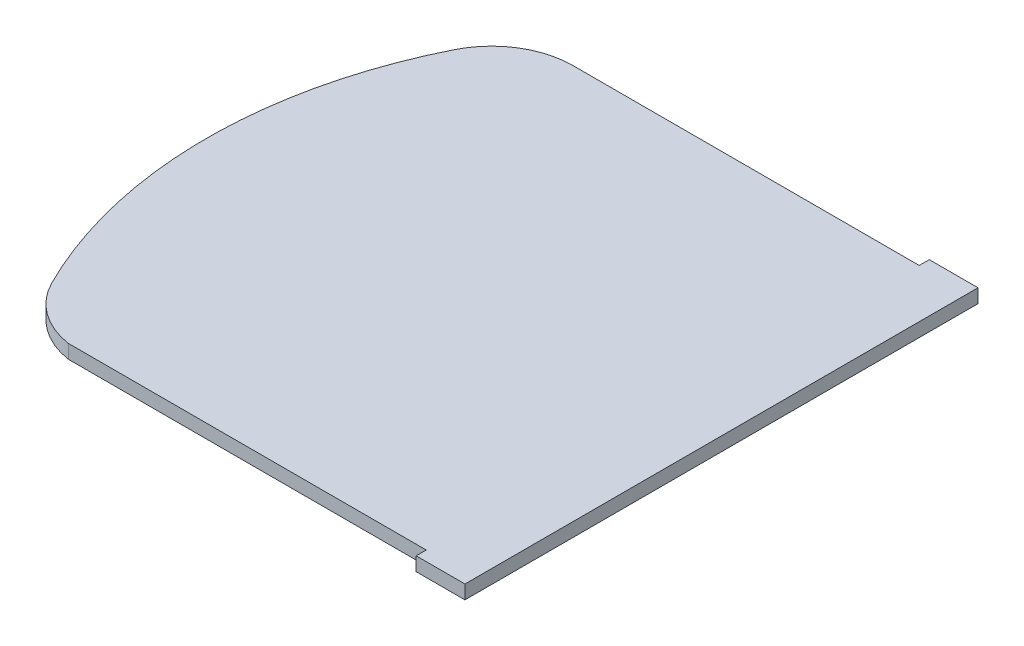
ISO-10303-21;
HEADER;
FILE_DESCRIPTION(('STEP AP214'),'2;1');
FILE_NAME('part.step','',(''),(''),'','','');
FILE_SCHEMA(('AUTOMOTIVE_DESIGN { 1 0 10303 214 1 1 1 1 }'));
ENDSEC;
DATA;
#1=APPLICATION_CONTEXT('core data for automotive mechanical design processes');
#2=APPLICATION_PROTOCOL_DEFINITION('international standard','automotive_design',2000,#1);
#3=PRODUCT_CONTEXT('',#1,'mechanical');
#4=PRODUCT('Part','Part','',(#3));
#5=PRODUCT_RELATED_PRODUCT_CATEGORY('part','',(#4));
#6=PRODUCT_DEFINITION_FORMATION('','',#4);
#7=PRODUCT_DEFINITION_CONTEXT('part definition',#1,'design');
#8=PRODUCT_DEFINITION('design','',#6,#7);
#9=PRODUCT_DEFINITION_SHAPE('','',#8);
#10=(LENGTH_UNIT() NAMED_UNIT(*) SI_UNIT(.MILLI.,.METRE.));
#11=(NAMED_UNIT(*) PLANE_ANGLE_UNIT() SI_UNIT($,.RADIAN.));
#12=(NAMED_UNIT(*) SI_UNIT($,.STERADIAN.) SOLID_ANGLE_UNIT());
#13=UNCERTAINTY_MEASURE_WITH_UNIT(LENGTH_MEASURE(1.E-05),#10,'distance_accuracy_value','');
#14=(GEOMETRIC_REPRESENTATION_CONTEXT(3) GLOBAL_UNCERTAINTY_ASSIGNED_CONTEXT((#13)) GLOBAL_UNIT_ASSIGNED_CONTEXT((#10,
#11,#12)) REPRESENTATION_CONTEXT('',''));
#15=CARTESIAN_POINT('',(0.,0.,0.));
#16=DIRECTION('',(0.,0.,1.));
#17=DIRECTION('',(1.,0.,0.));
#18=AXIS2_PLACEMENT_3D('',#15,#16,#17);
#19=CARTESIAN_POINT('',(0.,6.5,-242.));
#20=DIRECTION('',(0.,0.,1.));
#21=DIRECTION('',(1.,0.,0.));
#22=AXIS2_PLACEMENT_3D('',#19,#20,#21);
#23=PLANE('',#22);
#24=DIRECTION('',(-1.,0.,0.));
#25=VECTOR('',#24,1.);
#26=CARTESIAN_POINT('',(0.,-6.5,-242.));
#27=LINE('',#26,#25);
#28=CARTESIAN_POINT('',(0.,-6.5,-242.));
#29=VERTEX_POINT('',#28);
#30=CARTESIAN_POINT('',(-46.,-6.5,-242.));
#31=VERTEX_POINT('',#30);
#32=EDGE_CURVE('E143',#29,#31,#27,.T.);
#33=ORIENTED_EDGE('',*,*,#32,.T.);
#34=DIRECTION('',(0.,-1.,0.));
#35=VECTOR('',#34,1.);
#36=CARTESIAN_POINT('',(-46.,6.5,-242.));
#37=LINE('',#36,#35);
#38=CARTESIAN_POINT('',(-46.,6.5,-242.));
#39=VERTEX_POINT('',#38);
#40=EDGE_CURVE('E11',#39,#31,#37,.T.);
#41=ORIENTED_EDGE('',*,*,#40,.F.);
#42=DIRECTION('',(-1.,0.,0.));
#43=VECTOR('',#42,1.);
#44=CARTESIAN_POINT('',(0.,6.5,-242.));
#45=LINE('',#44,#43);
#46=CARTESIAN_POINT('',(0.,6.5,-242.));
#47=VERTEX_POINT('',#46);
#48=EDGE_CURVE('E161',#47,#39,#45,.T.);
#49=ORIENTED_EDGE('',*,*,#48,.F.);
#50=DIRECTION('',(0.,-1.,0.));
#51=VECTOR('',#50,1.);
#52=CARTESIAN_POINT('',(0.,6.5,-242.));
#53=LINE('',#52,#51);
#54=EDGE_CURVE('E139',#47,#29,#53,.T.);
#55=ORIENTED_EDGE('',*,*,#54,.T.);
#56=EDGE_LOOP('',(#33,#41,#49,#55));
#57=FACE_BOUND('',#56,.T.);
#58=ADVANCED_FACE('F35',(#57),#23,.F.);
#59=CARTESIAN_POINT('',(-46.,6.5,-242.));
#60=DIRECTION('',(1.,0.,0.));
#61=DIRECTION('',(0.,0.,-1.));
#62=AXIS2_PLACEMENT_3D('',#59,#60,#61);
#63=PLANE('',#62);
#64=DIRECTION('',(0.,0.,1.));
#65=VECTOR('',#64,1.);
#66=CARTESIAN_POINT('',(-46.,-6.5,-242.));
#67=LINE('',#66,#65);
#68=CARTESIAN_POINT('',(-45.9999999999999,-6.5,-232.5));
#69=VERTEX_POINT('',#68);
#70=EDGE_CURVE('E146',#31,#69,#67,.T.);
#71=ORIENTED_EDGE('',*,*,#70,.T.);
#72=DIRECTION('',(0.,-1.,0.));
#73=VECTOR('',#72,1.);
#74=CARTESIAN_POINT('',(-45.9999999999999,6.5,-232.5));
#75=LINE('',#74,#73);
#76=CARTESIAN_POINT('',(-45.9999999999999,6.5,-232.5));
#77=VERTEX_POINT('',#76);
#78=EDGE_CURVE('E43',#77,#69,#75,.T.);
#79=ORIENTED_EDGE('',*,*,#78,.F.);
#80=DIRECTION('',(0.,0.,1.));
#81=VECTOR('',#80,1.);
#82=CARTESIAN_POINT('',(-46.,6.5,-242.));
#83=LINE('',#82,#81);
#84=EDGE_CURVE('E100',#39,#77,#83,.T.);
#85=ORIENTED_EDGE('',*,*,#84,.F.);
#86=ORIENTED_EDGE('',*,*,#40,.T.);
#87=EDGE_LOOP('',(#71,#79,#85,#86));
#88=FACE_BOUND('',#87,.T.);
#89=ADVANCED_FACE('F210',(#88),#63,.F.);
#90=CARTESIAN_POINT('',(-45.9999999999999,6.5,-232.5));
#91=DIRECTION('',(0.,0.,1.));
#92=DIRECTION('',(1.,0.,0.));
#93=AXIS2_PLACEMENT_3D('',#90,#91,#92);
#94=PLANE('',#93);
#95=DIRECTION('',(-1.,0.,0.));
#96=VECTOR('',#95,1.);
#97=CARTESIAN_POINT('',(-45.9999999999999,-6.5,-232.5));
#98=LINE('',#97,#96);
#99=CARTESIAN_POINT('',(-372.443194837078,-6.5,-232.5));
#100=VERTEX_POINT('',#99);
#101=EDGE_CURVE('E148',#69,#100,#98,.T.);
#102=ORIENTED_EDGE('',*,*,#101,.T.);
#103=DIRECTION('',(0.,-1.,0.));
#104=VECTOR('',#103,1.);
#105=CARTESIAN_POINT('',(-372.443194837078,6.5,-232.5));
#106=LINE('',#105,#104);
#107=CARTESIAN_POINT('',(-372.443194837078,6.5,-232.5));
#108=VERTEX_POINT('',#107);
#109=EDGE_CURVE('E174',#108,#100,#106,.T.);
#110=ORIENTED_EDGE('',*,*,#109,.F.);
#111=DIRECTION('',(-1.,0.,0.));
#112=VECTOR('',#111,1.);
#113=CARTESIAN_POINT('',(-45.9999999999999,6.5,-232.5));
#114=LINE('',#113,#112);
#115=EDGE_CURVE('E182',#77,#108,#114,.T.);
#116=ORIENTED_EDGE('',*,*,#115,.F.);
#117=ORIENTED_EDGE('',*,*,#78,.T.);
#118=EDGE_LOOP('',(#102,#110,#116,#117));
#119=FACE_BOUND('',#118,.T.);
#120=ADVANCED_FACE('F180',(#119),#94,.F.);
#121=CARTESIAN_POINT('',(-372.443194837078,6.5,-155.5));
#122=DIRECTION('',(0.,-1.,0.));
#123=DIRECTION('',(0.,0.,-1.));
#124=AXIS2_PLACEMENT_3D('',#121,#122,#123);
#125=CYLINDRICAL_SURFACE('',#124,77.);
#126=CARTESIAN_POINT('',(-372.443194837078,-6.5,-155.5));
#127=DIRECTION('',(0.,1.,0.));
#128=DIRECTION('',(0.,0.,1.));
#129=AXIS2_PLACEMENT_3D('',#126,#127,#128);
#130=CIRCLE('',#129,77.);
#131=CARTESIAN_POINT('',(-441.377653296834,-6.5,-189.808022922636));
#132=VERTEX_POINT('',#131);
#133=EDGE_CURVE('E150',#100,#132,#130,.T.);
#134=ORIENTED_EDGE('',*,*,#133,.T.);
#135=DIRECTION('',(0.,-1.,0.));
#136=VECTOR('',#135,1.);
#137=CARTESIAN_POINT('',(-441.377653296834,6.5,-189.808022922636));
#138=LINE('',#137,#136);
#139=CARTESIAN_POINT('',(-441.377653296834,6.5,-189.808022922636));
#140=VERTEX_POINT('',#139);
#141=EDGE_CURVE('E171',#140,#132,#138,.T.);
#142=ORIENTED_EDGE('',*,*,#141,.F.);
#143=CARTESIAN_POINT('',(-372.443194837078,6.5,-155.5));
#144=DIRECTION('',(0.,1.,0.));
#145=DIRECTION('',(0.,0.,1.));
#146=AXIS2_PLACEMENT_3D('',#143,#144,#145);
#147=CIRCLE('',#146,77.);
#148=EDGE_CURVE('E200',#108,#140,#147,.T.);
#149=ORIENTED_EDGE('',*,*,#148,.F.);
#150=ORIENTED_EDGE('',*,*,#109,.T.);
#151=EDGE_LOOP('',(#134,#142,#149,#150));
#152=FACE_BOUND('',#151,.T.);
#153=ADVANCED_FACE('F191',(#152),#125,.T.);
#154=CARTESIAN_POINT('',(-60.,6.5,0.));
#155=DIRECTION('',(0.,-1.,0.));
#156=DIRECTION('',(0.,0.,-1.));
#157=AXIS2_PLACEMENT_3D('',#154,#155,#156);
#158=CYLINDRICAL_SURFACE('',#157,426.);
#159=CARTESIAN_POINT('',(-60.,-6.5,0.));
#160=DIRECTION('',(0.,1.,0.));
#161=DIRECTION('',(0.,0.,1.));
#162=AXIS2_PLACEMENT_3D('',#159,#160,#161);
#163=CIRCLE('',#162,426.);
#164=CARTESIAN_POINT('',(-440.836676217765,-6.5,190.891136639199));
#165=VERTEX_POINT('',#164);
#166=EDGE_CURVE('E152',#132,#165,#163,.T.);
#167=ORIENTED_EDGE('',*,*,#166,.T.);
#168=DIRECTION('',(0.,-1.,0.));
#169=VECTOR('',#168,1.);
#170=CARTESIAN_POINT('',(-440.836676217765,6.5,190.891136639199));
#171=LINE('',#170,#169);
#172=CARTESIAN_POINT('',(-440.836676217765,6.5,190.891136639199));
#173=VERTEX_POINT('',#172);
#174=EDGE_CURVE('E168',#173,#165,#171,.T.);
#175=ORIENTED_EDGE('',*,*,#174,.F.);
#176=CARTESIAN_POINT('',(-60.,6.5,0.));
#177=DIRECTION('',(0.,1.,0.));
#178=DIRECTION('',(0.,0.,1.));
#179=AXIS2_PLACEMENT_3D('',#176,#177,#178);
#180=CIRCLE('',#179,426.);
#181=EDGE_CURVE('E197',#140,#173,#180,.T.);
#182=ORIENTED_EDGE('',*,*,#181,.F.);
#183=ORIENTED_EDGE('',*,*,#141,.T.);
#184=EDGE_LOOP('',(#167,#175,#182,#183));
#185=FACE_BOUND('',#184,.T.);
#186=ADVANCED_FACE('F195',(#185),#158,.T.);
#187=CARTESIAN_POINT('',(-372.,6.5,156.387339641034));
#188=DIRECTION('',(0.,-1.,0.));
#189=DIRECTION('',(0.,0.,-1.));
#190=AXIS2_PLACEMENT_3D('',#187,#188,#189);
#191=CYLINDRICAL_SURFACE('',#190,77.);
#192=CARTESIAN_POINT('',(-372.,-6.5,156.387339641034));
#193=DIRECTION('',(0.,1.,0.));
#194=DIRECTION('',(0.,0.,1.));
#195=AXIS2_PLACEMENT_3D('',#192,#193,#194);
#196=CIRCLE('',#195,77.);
#197=CARTESIAN_POINT('',(-383.656025612559,-6.5,232.5));
#198=VERTEX_POINT('',#197);
#199=EDGE_CURVE('E154',#165,#198,#196,.T.);
#200=ORIENTED_EDGE('',*,*,#199,.T.);
#201=DIRECTION('',(0.,-1.,0.));
#202=VECTOR('',#201,1.);
#203=CARTESIAN_POINT('',(-383.656025612559,6.5,232.5));
#204=LINE('',#203,#202);
#205=CARTESIAN_POINT('',(-383.656025612559,6.5,232.5));
#206=VERTEX_POINT('',#205);
#207=EDGE_CURVE('E165',#206,#198,#204,.T.);
#208=ORIENTED_EDGE('',*,*,#207,.F.);
#209=CARTESIAN_POINT('',(-372.,6.5,156.387339641034));
#210=DIRECTION('',(0.,1.,0.));
#211=DIRECTION('',(0.,0.,1.));
#212=AXIS2_PLACEMENT_3D('',#209,#210,#211);
#213=CIRCLE('',#212,77.);
#214=EDGE_CURVE('E199',#173,#206,#213,.T.);
#215=ORIENTED_EDGE('',*,*,#214,.F.);
#216=ORIENTED_EDGE('',*,*,#174,.T.);
#217=EDGE_LOOP('',(#200,#208,#215,#216));
#218=FACE_BOUND('',#217,.T.);
#219=ADVANCED_FACE('F222',(#218),#191,.T.);
#220=CARTESIAN_POINT('',(-383.656025612559,6.5,232.5));
#221=DIRECTION('',(0.,0.,-1.));
#222=DIRECTION('',(-1.,0.,0.));
#223=AXIS2_PLACEMENT_3D('',#220,#221,#222);
#224=PLANE('',#223);
#225=DIRECTION('',(1.,0.,0.));
#226=VECTOR('',#225,1.);
#227=CARTESIAN_POINT('',(-383.656025612559,-6.5,232.5));
#228=LINE('',#227,#226);
#229=CARTESIAN_POINT('',(-45.9999999999999,-6.5,232.5));
#230=VERTEX_POINT('',#229);
#231=EDGE_CURVE('E156',#198,#230,#228,.T.);
#232=ORIENTED_EDGE('',*,*,#231,.T.);
#233=DIRECTION('',(0.,-1.,0.));
#234=VECTOR('',#233,1.);
#235=CARTESIAN_POINT('',(-45.9999999999999,6.5,232.5));
#236=LINE('',#235,#234);
#237=CARTESIAN_POINT('',(-45.9999999999999,6.5,232.5));
#238=VERTEX_POINT('',#237);
#239=EDGE_CURVE('E134',#238,#230,#236,.T.);
#240=ORIENTED_EDGE('',*,*,#239,.F.);
#241=DIRECTION('',(1.,0.,0.));
#242=VECTOR('',#241,1.);
#243=CARTESIAN_POINT('',(-383.656025612559,6.5,232.5));
#244=LINE('',#243,#242);
#245=EDGE_CURVE('E125',#206,#238,#244,.T.);
#246=ORIENTED_EDGE('',*,*,#245,.F.);
#247=ORIENTED_EDGE('',*,*,#207,.T.);
#248=EDGE_LOOP('',(#232,#240,#246,#247));
#249=FACE_BOUND('',#248,.T.);
#250=ADVANCED_FACE('F225',(#249),#224,.F.);
#251=CARTESIAN_POINT('',(-45.9999999999999,6.5,232.5));
#252=DIRECTION('',(1.,0.,0.));
#253=DIRECTION('',(0.,0.,-1.));
#254=AXIS2_PLACEMENT_3D('',#251,#252,#253);
#255=PLANE('',#254);
#256=DIRECTION('',(0.,0.,1.));
#257=VECTOR('',#256,1.);
#258=CARTESIAN_POINT('',(-45.9999999999999,-6.5,232.5));
#259=LINE('',#258,#257);
#260=CARTESIAN_POINT('',(-46.,-6.5,242.));
#261=VERTEX_POINT('',#260);
#262=EDGE_CURVE('E133',#230,#261,#259,.T.);
#263=ORIENTED_EDGE('',*,*,#262,.T.);
#264=DIRECTION('',(0.,-1.,0.));
#265=VECTOR('',#264,1.);
#266=CARTESIAN_POINT('',(-46.,6.5,242.));
#267=LINE('',#266,#265);
#268=CARTESIAN_POINT('',(-46.,6.5,242.));
#269=VERTEX_POINT('',#268);
#270=EDGE_CURVE('E130',#269,#261,#267,.T.);
#271=ORIENTED_EDGE('',*,*,#270,.F.);
#272=DIRECTION('',(0.,0.,1.));
#273=VECTOR('',#272,1.);
#274=CARTESIAN_POINT('',(-45.9999999999999,6.5,232.5));
#275=LINE('',#274,#273);
#276=EDGE_CURVE('E119',#238,#269,#275,.T.);
#277=ORIENTED_EDGE('',*,*,#276,.F.);
#278=ORIENTED_EDGE('',*,*,#239,.T.);
#279=EDGE_LOOP('',(#263,#271,#277,#278));
#280=FACE_BOUND('',#279,.T.);
#281=ADVANCED_FACE('F131',(#280),#255,.F.);
#282=CARTESIAN_POINT('',(-46.,6.5,242.));
#283=DIRECTION('',(0.,0.,-1.));
#284=DIRECTION('',(-1.,0.,0.));
#285=AXIS2_PLACEMENT_3D('',#282,#283,#284);
#286=PLANE('',#285);
#287=DIRECTION('',(1.,0.,0.));
#288=VECTOR('',#287,1.);
#289=CARTESIAN_POINT('',(-46.,-6.5,242.));
#290=LINE('',#289,#288);
#291=CARTESIAN_POINT('',(0.,-6.5,242.));
#292=VERTEX_POINT('',#291);
#293=EDGE_CURVE('E86',#261,#292,#290,.T.);
#294=ORIENTED_EDGE('',*,*,#293,.T.);
#295=DIRECTION('',(0.,-1.,0.));
#296=VECTOR('',#295,1.);
#297=CARTESIAN_POINT('',(0.,6.5,242.));
#298=LINE('',#297,#296);
#299=CARTESIAN_POINT('',(0.,6.5,242.));
#300=VERTEX_POINT('',#299);
#301=EDGE_CURVE('E135',#300,#292,#298,.T.);
#302=ORIENTED_EDGE('',*,*,#301,.F.);
#303=DIRECTION('',(1.,0.,0.));
#304=VECTOR('',#303,1.);
#305=CARTESIAN_POINT('',(-46.,6.5,242.));
#306=LINE('',#305,#304);
#307=EDGE_CURVE('E123',#269,#300,#306,.T.);
#308=ORIENTED_EDGE('',*,*,#307,.F.);
#309=ORIENTED_EDGE('',*,*,#270,.T.);
#310=EDGE_LOOP('',(#294,#302,#308,#309));
#311=FACE_BOUND('',#310,.T.);
#312=ADVANCED_FACE('F137',(#311),#286,.F.);
#313=CARTESIAN_POINT('',(0.,6.5,-242.));
#314=DIRECTION('',(-1.,0.,0.));
#315=DIRECTION('',(0.,0.,1.));
#316=AXIS2_PLACEMENT_3D('',#313,#314,#315);
#317=PLANE('',#316);
#318=DIRECTION('',(0.,0.,-1.));
#319=VECTOR('',#318,1.);
#320=CARTESIAN_POINT('',(0.,-6.5,-242.));
#321=LINE('',#320,#319);
#322=EDGE_CURVE('E92',#292,#29,#321,.T.);
#323=ORIENTED_EDGE('',*,*,#322,.T.);
#324=ORIENTED_EDGE('',*,*,#54,.F.);
#325=DIRECTION('',(0.,0.,-1.));
#326=VECTOR('',#325,1.);
#327=CARTESIAN_POINT('',(0.,6.5,-242.));
#328=LINE('',#327,#326);
#329=EDGE_CURVE('E51',#300,#47,#328,.T.);
#330=ORIENTED_EDGE('',*,*,#329,.F.);
#331=ORIENTED_EDGE('',*,*,#301,.T.);
#332=EDGE_LOOP('',(#323,#324,#330,#331));
#333=FACE_BOUND('',#332,.T.);
#334=ADVANCED_FACE('F234',(#333),#317,.F.);
#335=CARTESIAN_POINT('',(-372.443194837078,6.5,-155.5));
#336=DIRECTION('',(0.,1.,0.));
#337=DIRECTION('',(0.,0.,1.));
#338=AXIS2_PLACEMENT_3D('',#335,#336,#337);
#339=PLANE('',#338);
#340=ORIENTED_EDGE('',*,*,#48,.T.);
#341=ORIENTED_EDGE('',*,*,#84,.T.);
#342=ORIENTED_EDGE('',*,*,#115,.T.);
#343=ORIENTED_EDGE('',*,*,#148,.T.);
#344=ORIENTED_EDGE('',*,*,#181,.T.);
#345=ORIENTED_EDGE('',*,*,#214,.T.);
#346=ORIENTED_EDGE('',*,*,#245,.T.);
#347=ORIENTED_EDGE('',*,*,#276,.T.);
#348=ORIENTED_EDGE('',*,*,#307,.T.);
#349=ORIENTED_EDGE('',*,*,#329,.T.);
#350=EDGE_LOOP('',(#340,#341,#342,#343,#344,#345,#346,#347,#348,#349));
#351=FACE_BOUND('',#350,.T.);
#352=ADVANCED_FACE('F121',(#351),#339,.T.);
#353=CARTESIAN_POINT('',(-372.443194837078,-6.5,-155.5));
#354=DIRECTION('',(0.,1.,0.));
#355=DIRECTION('',(0.,0.,1.));
#356=AXIS2_PLACEMENT_3D('',#353,#354,#355);
#357=PLANE('',#356);
#358=ORIENTED_EDGE('',*,*,#32,.F.);
#359=ORIENTED_EDGE('',*,*,#322,.F.);
#360=ORIENTED_EDGE('',*,*,#293,.F.);
#361=ORIENTED_EDGE('',*,*,#262,.F.);
#362=ORIENTED_EDGE('',*,*,#231,.F.);
#363=ORIENTED_EDGE('',*,*,#199,.F.);
#364=ORIENTED_EDGE('',*,*,#166,.F.);
#365=ORIENTED_EDGE('',*,*,#133,.F.);
#366=ORIENTED_EDGE('',*,*,#101,.F.);
#367=ORIENTED_EDGE('',*,*,#70,.F.);
#368=EDGE_LOOP('',(#358,#359,#360,#361,#362,#363,#364,#365,#366,#367));
#369=FACE_BOUND('',#368,.T.);
#370=ADVANCED_FACE('F186',(#369),#357,.F.);
#371=CLOSED_SHELL('',(#58,#89,#120,#153,#186,#219,#250,#281,#312,#334,#352,#370));
#372=MANIFOLD_SOLID_BREP('B2',#371);
#373=ADVANCED_BREP_SHAPE_REPRESENTATION('',(#18,#372),#14);
#374=SHAPE_DEFINITION_REPRESENTATION(#9,#373);
ENDSEC;
END-ISO-10303-21;
